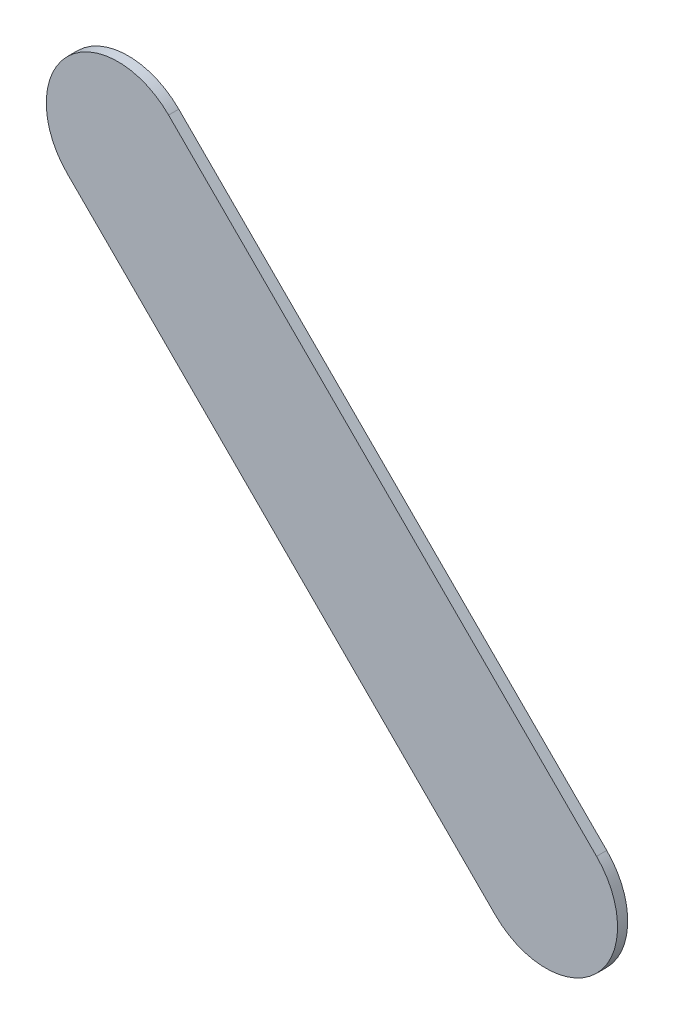
ISO-10303-21;
HEADER;
FILE_DESCRIPTION(('STEP AP214'),'2;1');
FILE_NAME('part.step','',(''),(''),'','','');
FILE_SCHEMA(('AUTOMOTIVE_DESIGN { 1 0 10303 214 1 1 1 1 }'));
ENDSEC;
DATA;
#1=APPLICATION_CONTEXT('core data for automotive mechanical design processes');
#2=APPLICATION_PROTOCOL_DEFINITION('international standard','automotive_design',2000,#1);
#3=PRODUCT_CONTEXT('',#1,'mechanical');
#4=PRODUCT('Part','Part','',(#3));
#5=PRODUCT_RELATED_PRODUCT_CATEGORY('part','',(#4));
#6=PRODUCT_DEFINITION_FORMATION('','',#4);
#7=PRODUCT_DEFINITION_CONTEXT('part definition',#1,'design');
#8=PRODUCT_DEFINITION('design','',#6,#7);
#9=PRODUCT_DEFINITION_SHAPE('','',#8);
#10=(LENGTH_UNIT() NAMED_UNIT(*) SI_UNIT(.MILLI.,.METRE.));
#11=(NAMED_UNIT(*) PLANE_ANGLE_UNIT() SI_UNIT($,.RADIAN.));
#12=(NAMED_UNIT(*) SI_UNIT($,.STERADIAN.) SOLID_ANGLE_UNIT());
#13=UNCERTAINTY_MEASURE_WITH_UNIT(LENGTH_MEASURE(1.E-05),#10,'distance_accuracy_value','');
#14=(GEOMETRIC_REPRESENTATION_CONTEXT(3) GLOBAL_UNCERTAINTY_ASSIGNED_CONTEXT((#13)) GLOBAL_UNIT_ASSIGNED_CONTEXT((#10,
#11,#12)) REPRESENTATION_CONTEXT('',''));
#15=CARTESIAN_POINT('',(0.,0.,0.));
#16=DIRECTION('',(0.,0.,1.));
#17=DIRECTION('',(1.,0.,0.));
#18=AXIS2_PLACEMENT_3D('',#15,#16,#17);
#19=CARTESIAN_POINT('',(94.7300239,97.81642362,0.));
#20=DIRECTION('',(0.707106781186548,0.707106781186548,0.));
#21=DIRECTION('',(0.707106781186548,-0.707106781186548,0.));
#22=AXIS2_PLACEMENT_3D('',#19,#20,#21);
#23=PLANE('',#22);
#24=DIRECTION('',(0.707106781186548,-0.707106781186548,0.));
#25=VECTOR('',#24,1.);
#26=CARTESIAN_POINT('',(94.7300239,97.81642362,0.03556));
#27=LINE('',#26,#25);
#28=CARTESIAN_POINT('',(94.7300239,97.81642362,0.03556));
#29=VERTEX_POINT('',#28);
#30=CARTESIAN_POINT('',(96.22322386,96.32322366,0.03556));
#31=VERTEX_POINT('',#30);
#32=EDGE_CURVE('E11',#29,#31,#27,.T.);
#33=ORIENTED_EDGE('',*,*,#32,.F.);
#34=DIRECTION('',(0.,0.,1.));
#35=VECTOR('',#34,1.);
#36=CARTESIAN_POINT('',(94.7300239,97.81642362,0.));
#37=LINE('',#36,#35);
#38=CARTESIAN_POINT('',(94.7300239,97.81642362,0.));
#39=VERTEX_POINT('',#38);
#40=EDGE_CURVE('E24',#39,#29,#37,.T.);
#41=ORIENTED_EDGE('',*,*,#40,.F.);
#42=DIRECTION('',(0.707106781186548,-0.707106781186548,0.));
#43=VECTOR('',#42,1.);
#44=CARTESIAN_POINT('',(94.7300239,97.81642362,0.));
#45=LINE('',#44,#43);
#46=CARTESIAN_POINT('',(96.22322386,96.32322366,0.));
#47=VERTEX_POINT('',#46);
#48=EDGE_CURVE('E75',#39,#47,#45,.T.);
#49=ORIENTED_EDGE('',*,*,#48,.T.);
#50=DIRECTION('',(0.,0.,1.));
#51=VECTOR('',#50,1.);
#52=CARTESIAN_POINT('',(96.22322386,96.32322366,0.));
#53=LINE('',#52,#51);
#54=EDGE_CURVE('E37',#47,#31,#53,.T.);
#55=ORIENTED_EDGE('',*,*,#54,.T.);
#56=EDGE_LOOP('',(#33,#41,#49,#55));
#57=FACE_BOUND('',#56,.T.);
#58=ADVANCED_FACE('F17',(#57),#23,.F.);
#59=CARTESIAN_POINT('',(96.40000024,96.50000004,0.));
#60=DIRECTION('',(0.,0.,-1.));
#61=DIRECTION('',(-0.707106781186548,-0.707106781186548,0.));
#62=AXIS2_PLACEMENT_3D('',#59,#60,#61);
#63=CYLINDRICAL_SURFACE('',#62,0.24999955410322);
#64=CARTESIAN_POINT('',(96.40000024,96.50000004,0.03556));
#65=DIRECTION('',(0.,0.,1.));
#66=DIRECTION('',(-0.707106781186548,-0.707106781186548,0.));
#67=AXIS2_PLACEMENT_3D('',#64,#65,#66);
#68=CIRCLE('',#67,0.24999955410322);
#69=CARTESIAN_POINT('',(96.57677662,96.67677642,0.03556));
#70=VERTEX_POINT('',#69);
#71=EDGE_CURVE('E83',#31,#70,#68,.T.);
#72=ORIENTED_EDGE('',*,*,#71,.F.);
#73=ORIENTED_EDGE('',*,*,#54,.F.);
#74=CARTESIAN_POINT('',(96.40000024,96.50000004,0.));
#75=DIRECTION('',(0.,0.,1.));
#76=DIRECTION('',(-0.707106781186548,-0.707106781186548,0.));
#77=AXIS2_PLACEMENT_3D('',#74,#75,#76);
#78=CIRCLE('',#77,0.24999955410322);
#79=CARTESIAN_POINT('',(96.57677662,96.67677642,0.));
#80=VERTEX_POINT('',#79);
#81=EDGE_CURVE('E81',#47,#80,#78,.T.);
#82=ORIENTED_EDGE('',*,*,#81,.T.);
#83=DIRECTION('',(0.,0.,1.));
#84=VECTOR('',#83,1.);
#85=CARTESIAN_POINT('',(96.57677662,96.67677642,0.));
#86=LINE('',#85,#84);
#87=EDGE_CURVE('E67',#80,#70,#86,.T.);
#88=ORIENTED_EDGE('',*,*,#87,.T.);
#89=EDGE_LOOP('',(#72,#73,#82,#88));
#90=FACE_BOUND('',#89,.T.);
#91=ADVANCED_FACE('F89',(#90),#63,.T.);
#92=CARTESIAN_POINT('',(96.57677662,96.67677642,0.));
#93=DIRECTION('',(-0.707106781186548,-0.707106781186548,0.));
#94=DIRECTION('',(-0.707106781186548,0.707106781186548,0.));
#95=AXIS2_PLACEMENT_3D('',#92,#93,#94);
#96=PLANE('',#95);
#97=DIRECTION('',(-0.707106781186548,0.707106781186548,0.));
#98=VECTOR('',#97,1.);
#99=CARTESIAN_POINT('',(96.57677662,96.67677642,0.03556));
#100=LINE('',#99,#98);
#101=CARTESIAN_POINT('',(95.08357666,98.16997638,0.03556));
#102=VERTEX_POINT('',#101);
#103=EDGE_CURVE('E71',#70,#102,#100,.T.);
#104=ORIENTED_EDGE('',*,*,#103,.F.);
#105=ORIENTED_EDGE('',*,*,#87,.F.);
#106=DIRECTION('',(-0.707106781186548,0.707106781186548,0.));
#107=VECTOR('',#106,1.);
#108=CARTESIAN_POINT('',(96.57677662,96.67677642,0.));
#109=LINE('',#108,#107);
#110=CARTESIAN_POINT('',(95.08357666,98.16997638,0.));
#111=VERTEX_POINT('',#110);
#112=EDGE_CURVE('E63',#80,#111,#109,.T.);
#113=ORIENTED_EDGE('',*,*,#112,.T.);
#114=DIRECTION('',(0.,0.,1.));
#115=VECTOR('',#114,1.);
#116=CARTESIAN_POINT('',(95.08357666,98.16997638,0.));
#117=LINE('',#116,#115);
#118=EDGE_CURVE('E53',#111,#102,#117,.T.);
#119=ORIENTED_EDGE('',*,*,#118,.T.);
#120=EDGE_LOOP('',(#104,#105,#113,#119));
#121=FACE_BOUND('',#120,.T.);
#122=ADVANCED_FACE('F66',(#121),#96,.F.);
#123=CARTESIAN_POINT('',(94.90680028,97.9932,0.));
#124=DIRECTION('',(0.,0.,-1.));
#125=DIRECTION('',(0.707106781186548,0.707106781186548,0.));
#126=AXIS2_PLACEMENT_3D('',#123,#124,#125);
#127=CYLINDRICAL_SURFACE('',#126,0.24999955410322);
#128=CARTESIAN_POINT('',(94.90680028,97.9932,0.03556));
#129=DIRECTION('',(0.,0.,1.));
#130=DIRECTION('',(0.707106781186548,0.707106781186548,0.));
#131=AXIS2_PLACEMENT_3D('',#128,#129,#130);
#132=CIRCLE('',#131,0.24999955410322);
#133=EDGE_CURVE('E59',#102,#29,#132,.T.);
#134=ORIENTED_EDGE('',*,*,#133,.F.);
#135=ORIENTED_EDGE('',*,*,#118,.F.);
#136=CARTESIAN_POINT('',(94.90680028,97.9932,0.));
#137=DIRECTION('',(0.,0.,1.));
#138=DIRECTION('',(0.707106781186548,0.707106781186548,0.));
#139=AXIS2_PLACEMENT_3D('',#136,#137,#138);
#140=CIRCLE('',#139,0.24999955410322);
#141=EDGE_CURVE('E57',#111,#39,#140,.T.);
#142=ORIENTED_EDGE('',*,*,#141,.T.);
#143=ORIENTED_EDGE('',*,*,#40,.T.);
#144=EDGE_LOOP('',(#134,#135,#142,#143));
#145=FACE_BOUND('',#144,.T.);
#146=ADVANCED_FACE('F55',(#145),#127,.T.);
#147=CARTESIAN_POINT('',(94.7300239,97.81642362,0.));
#148=DIRECTION('',(0.,0.,-1.));
#149=DIRECTION('',(-1.,0.,0.));
#150=AXIS2_PLACEMENT_3D('',#147,#148,#149);
#151=PLANE('',#150);
#152=ORIENTED_EDGE('',*,*,#141,.F.);
#153=ORIENTED_EDGE('',*,*,#112,.F.);
#154=ORIENTED_EDGE('',*,*,#81,.F.);
#155=ORIENTED_EDGE('',*,*,#48,.F.);
#156=EDGE_LOOP('',(#152,#153,#154,#155));
#157=FACE_BOUND('',#156,.T.);
#158=ADVANCED_FACE('F74',(#157),#151,.T.);
#159=CARTESIAN_POINT('',(94.7300239,97.81642362,0.03556));
#160=DIRECTION('',(0.,0.,-1.));
#161=DIRECTION('',(-1.,0.,0.));
#162=AXIS2_PLACEMENT_3D('',#159,#160,#161);
#163=PLANE('',#162);
#164=ORIENTED_EDGE('',*,*,#32,.T.);
#165=ORIENTED_EDGE('',*,*,#71,.T.);
#166=ORIENTED_EDGE('',*,*,#103,.T.);
#167=ORIENTED_EDGE('',*,*,#133,.T.);
#168=EDGE_LOOP('',(#164,#165,#166,#167));
#169=FACE_BOUND('',#168,.T.);
#170=ADVANCED_FACE('F91',(#169),#163,.F.);
#171=CLOSED_SHELL('',(#58,#91,#122,#146,#158,#170));
#172=MANIFOLD_SOLID_BREP('B1',#171);
#173=ADVANCED_BREP_SHAPE_REPRESENTATION('',(#18,#172),#14);
#174=SHAPE_DEFINITION_REPRESENTATION(#9,#173);
ENDSEC;
END-ISO-10303-21;
